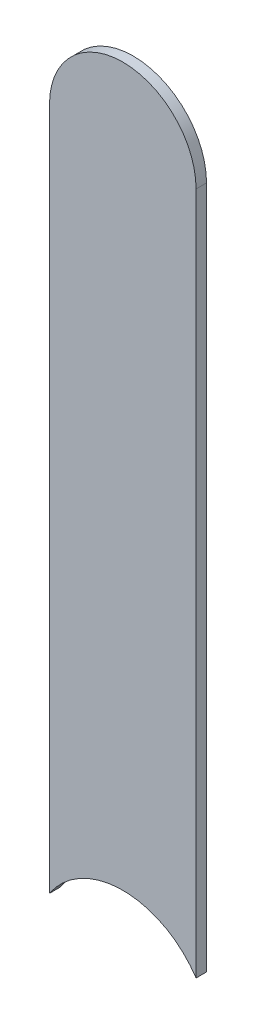
ISO-10303-21;
HEADER;
FILE_DESCRIPTION(('STEP AP214'),'2;1');
FILE_NAME('part.step','',(''),(''),'','','');
FILE_SCHEMA(('AUTOMOTIVE_DESIGN { 1 0 10303 214 1 1 1 1 }'));
ENDSEC;
DATA;
#1=APPLICATION_CONTEXT('core data for automotive mechanical design processes');
#2=APPLICATION_PROTOCOL_DEFINITION('international standard','automotive_design',2000,#1);
#3=PRODUCT_CONTEXT('',#1,'mechanical');
#4=PRODUCT('Part','Part','',(#3));
#5=PRODUCT_RELATED_PRODUCT_CATEGORY('part','',(#4));
#6=PRODUCT_DEFINITION_FORMATION('','',#4);
#7=PRODUCT_DEFINITION_CONTEXT('part definition',#1,'design');
#8=PRODUCT_DEFINITION('design','',#6,#7);
#9=PRODUCT_DEFINITION_SHAPE('','',#8);
#10=(LENGTH_UNIT() NAMED_UNIT(*) SI_UNIT(.MILLI.,.METRE.));
#11=(NAMED_UNIT(*) PLANE_ANGLE_UNIT() SI_UNIT($,.RADIAN.));
#12=(NAMED_UNIT(*) SI_UNIT($,.STERADIAN.) SOLID_ANGLE_UNIT());
#13=UNCERTAINTY_MEASURE_WITH_UNIT(LENGTH_MEASURE(1.E-05),#10,'distance_accuracy_value','');
#14=(GEOMETRIC_REPRESENTATION_CONTEXT(3) GLOBAL_UNCERTAINTY_ASSIGNED_CONTEXT((#13)) GLOBAL_UNIT_ASSIGNED_CONTEXT((#10,
#11,#12)) REPRESENTATION_CONTEXT('',''));
#15=CARTESIAN_POINT('',(0.,0.,0.));
#16=DIRECTION('',(0.,0.,1.));
#17=DIRECTION('',(1.,0.,0.));
#18=AXIS2_PLACEMENT_3D('',#15,#16,#17);
#19=CARTESIAN_POINT('',(94.6500139,83.1658173078553,0.));
#20=DIRECTION('',(-1.,0.,0.));
#21=DIRECTION('',(0.,1.,0.));
#22=AXIS2_PLACEMENT_3D('',#19,#20,#21);
#23=PLANE('',#22);
#24=DIRECTION('',(0.,1.,0.));
#25=VECTOR('',#24,1.);
#26=CARTESIAN_POINT('',(94.6500139,82.9999864,0.03556));
#27=LINE('',#26,#25);
#28=CARTESIAN_POINT('',(94.6500139,83.1658173078553,0.03556));
#29=VERTEX_POINT('',#28);
#30=CARTESIAN_POINT('',(94.6500139,85.4964,0.03556));
#31=VERTEX_POINT('',#30);
#32=EDGE_CURVE('E11',#29,#31,#27,.T.);
#33=ORIENTED_EDGE('',*,*,#32,.F.);
#34=DIRECTION('',(0.,0.,1.));
#35=VECTOR('',#34,1.);
#36=CARTESIAN_POINT('',(94.6500139,83.1658173078553,0.));
#37=LINE('',#36,#35);
#38=CARTESIAN_POINT('',(94.6500139,83.1658173078553,0.));
#39=VERTEX_POINT('',#38);
#40=EDGE_CURVE('E24',#39,#29,#37,.T.);
#41=ORIENTED_EDGE('',*,*,#40,.F.);
#42=DIRECTION('',(0.,1.,0.));
#43=VECTOR('',#42,1.);
#44=CARTESIAN_POINT('',(94.6500139,82.9999864,0.));
#45=LINE('',#44,#43);
#46=CARTESIAN_POINT('',(94.6500139,85.4964,0.));
#47=VERTEX_POINT('',#46);
#48=EDGE_CURVE('E75',#39,#47,#45,.T.);
#49=ORIENTED_EDGE('',*,*,#48,.T.);
#50=DIRECTION('',(0.,0.,1.));
#51=VECTOR('',#50,1.);
#52=CARTESIAN_POINT('',(94.6500139,85.4964,0.));
#53=LINE('',#52,#51);
#54=EDGE_CURVE('E37',#47,#31,#53,.T.);
#55=ORIENTED_EDGE('',*,*,#54,.T.);
#56=EDGE_LOOP('',(#33,#41,#49,#55));
#57=FACE_BOUND('',#56,.T.);
#58=ADVANCED_FACE('F17',(#57),#23,.F.);
#59=CARTESIAN_POINT('',(94.4000144,85.4964,0.));
#60=DIRECTION('',(0.,0.,-1.));
#61=DIRECTION('',(1.,0.,0.));
#62=AXIS2_PLACEMENT_3D('',#59,#60,#61);
#63=CYLINDRICAL_SURFACE('',#62,0.249999499999997);
#64=CARTESIAN_POINT('',(94.4000144,85.4964,0.03556));
#65=DIRECTION('',(0.,0.,1.));
#66=DIRECTION('',(1.,0.,0.));
#67=AXIS2_PLACEMENT_3D('',#64,#65,#66);
#68=CIRCLE('',#67,0.249999499999997);
#69=CARTESIAN_POINT('',(94.1500149,85.4964,0.03556));
#70=VERTEX_POINT('',#69);
#71=EDGE_CURVE('E83',#31,#70,#68,.T.);
#72=ORIENTED_EDGE('',*,*,#71,.F.);
#73=ORIENTED_EDGE('',*,*,#54,.F.);
#74=CARTESIAN_POINT('',(94.4000144,85.4964,0.));
#75=DIRECTION('',(0.,0.,1.));
#76=DIRECTION('',(1.,0.,0.));
#77=AXIS2_PLACEMENT_3D('',#74,#75,#76);
#78=CIRCLE('',#77,0.249999499999997);
#79=CARTESIAN_POINT('',(94.1500149,85.4964,0.));
#80=VERTEX_POINT('',#79);
#81=EDGE_CURVE('E81',#47,#80,#78,.T.);
#82=ORIENTED_EDGE('',*,*,#81,.T.);
#83=DIRECTION('',(0.,0.,1.));
#84=VECTOR('',#83,1.);
#85=CARTESIAN_POINT('',(94.1500149,85.4964,0.));
#86=LINE('',#85,#84);
#87=EDGE_CURVE('E67',#80,#70,#86,.T.);
#88=ORIENTED_EDGE('',*,*,#87,.T.);
#89=EDGE_LOOP('',(#72,#73,#82,#88));
#90=FACE_BOUND('',#89,.T.);
#91=ADVANCED_FACE('F89',(#90),#63,.T.);
#92=CARTESIAN_POINT('',(94.1500149,85.4964,0.));
#93=DIRECTION('',(1.,0.,0.));
#94=DIRECTION('',(0.,-1.,0.));
#95=AXIS2_PLACEMENT_3D('',#92,#93,#94);
#96=PLANE('',#95);
#97=DIRECTION('',(0.,-1.,0.));
#98=VECTOR('',#97,1.);
#99=CARTESIAN_POINT('',(94.1500149,85.4964,0.03556));
#100=LINE('',#99,#98);
#101=CARTESIAN_POINT('',(94.1500149,83.1658173078553,0.03556));
#102=VERTEX_POINT('',#101);
#103=EDGE_CURVE('E71',#70,#102,#100,.T.);
#104=ORIENTED_EDGE('',*,*,#103,.F.);
#105=ORIENTED_EDGE('',*,*,#87,.F.);
#106=DIRECTION('',(0.,-1.,0.));
#107=VECTOR('',#106,1.);
#108=CARTESIAN_POINT('',(94.1500149,85.4964,0.));
#109=LINE('',#108,#107);
#110=CARTESIAN_POINT('',(94.1500149,83.1658173078553,0.));
#111=VERTEX_POINT('',#110);
#112=EDGE_CURVE('E63',#80,#111,#109,.T.);
#113=ORIENTED_EDGE('',*,*,#112,.T.);
#114=DIRECTION('',(0.,0.,1.));
#115=VECTOR('',#114,1.);
#116=CARTESIAN_POINT('',(94.1500149,83.1658173078553,0.));
#117=LINE('',#116,#115);
#118=EDGE_CURVE('E53',#111,#102,#117,.T.);
#119=ORIENTED_EDGE('',*,*,#118,.T.);
#120=EDGE_LOOP('',(#104,#105,#113,#119));
#121=FACE_BOUND('',#120,.T.);
#122=ADVANCED_FACE('F66',(#121),#96,.F.);
#123=CARTESIAN_POINT('',(94.4000144,82.9999864,0.));
#124=DIRECTION('',(0.,0.,-1.));
#125=DIRECTION('',(1.,0.,0.));
#126=AXIS2_PLACEMENT_3D('',#123,#124,#125);
#127=CYLINDRICAL_SURFACE('',#126,0.2999994);
#128=ORIENTED_EDGE('',*,*,#40,.T.);
#129=CARTESIAN_POINT('',(94.4000144,82.9999864,0.03556));
#130=DIRECTION('',(0.,0.,1.));
#131=DIRECTION('',(1.,0.,0.));
#132=AXIS2_PLACEMENT_3D('',#129,#130,#131);
#133=CIRCLE('',#132,0.2999994);
#134=EDGE_CURVE('E59',#29,#102,#133,.T.);
#135=ORIENTED_EDGE('',*,*,#134,.T.);
#136=ORIENTED_EDGE('',*,*,#118,.F.);
#137=CARTESIAN_POINT('',(94.4000144,82.9999864,0.));
#138=DIRECTION('',(0.,0.,1.));
#139=DIRECTION('',(1.,0.,0.));
#140=AXIS2_PLACEMENT_3D('',#137,#138,#139);
#141=CIRCLE('',#140,0.2999994);
#142=EDGE_CURVE('E57',#39,#111,#141,.T.);
#143=ORIENTED_EDGE('',*,*,#142,.F.);
#144=EDGE_LOOP('',(#128,#135,#136,#143));
#145=FACE_BOUND('',#144,.T.);
#146=ADVANCED_FACE('F55',(#145),#127,.F.);
#147=CARTESIAN_POINT('',(94.6500139,82.9999864,0.));
#148=DIRECTION('',(0.,0.,-1.));
#149=DIRECTION('',(-1.,0.,0.));
#150=AXIS2_PLACEMENT_3D('',#147,#148,#149);
#151=PLANE('',#150);
#152=ORIENTED_EDGE('',*,*,#48,.F.);
#153=ORIENTED_EDGE('',*,*,#142,.T.);
#154=ORIENTED_EDGE('',*,*,#112,.F.);
#155=ORIENTED_EDGE('',*,*,#81,.F.);
#156=EDGE_LOOP('',(#152,#153,#154,#155));
#157=FACE_BOUND('',#156,.T.);
#158=ADVANCED_FACE('F74',(#157),#151,.T.);
#159=CARTESIAN_POINT('',(94.6500139,82.9999864,0.03556));
#160=DIRECTION('',(0.,0.,-1.));
#161=DIRECTION('',(-1.,0.,0.));
#162=AXIS2_PLACEMENT_3D('',#159,#160,#161);
#163=PLANE('',#162);
#164=ORIENTED_EDGE('',*,*,#134,.F.);
#165=ORIENTED_EDGE('',*,*,#32,.T.);
#166=ORIENTED_EDGE('',*,*,#71,.T.);
#167=ORIENTED_EDGE('',*,*,#103,.T.);
#168=EDGE_LOOP('',(#164,#165,#166,#167));
#169=FACE_BOUND('',#168,.T.);
#170=ADVANCED_FACE('F91',(#169),#163,.F.);
#171=CLOSED_SHELL('',(#58,#91,#122,#146,#158,#170));
#172=MANIFOLD_SOLID_BREP('B1',#171);
#173=ADVANCED_BREP_SHAPE_REPRESENTATION('',(#18,#172),#14);
#174=SHAPE_DEFINITION_REPRESENTATION(#9,#173);
ENDSEC;
END-ISO-10303-21;
